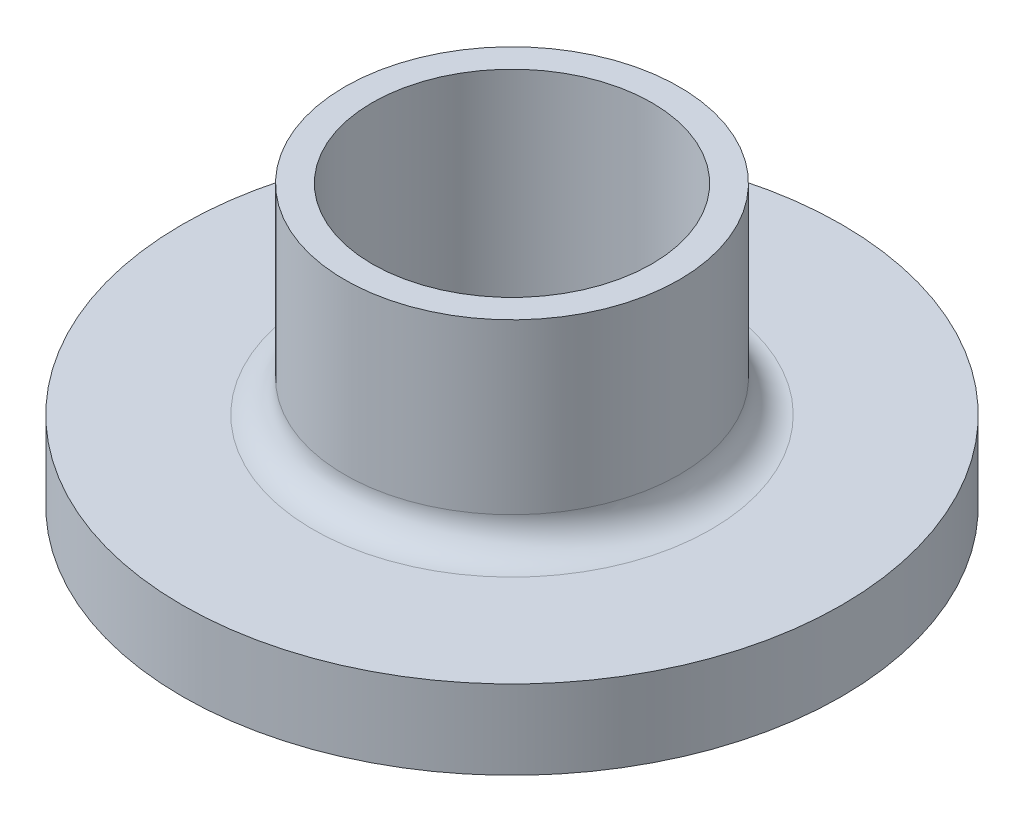
ISO-10303-21;
HEADER;
FILE_DESCRIPTION(('STEP AP214'),'2;1');
FILE_NAME('part.step','',(''),(''),'','','');
FILE_SCHEMA(('AUTOMOTIVE_DESIGN { 1 0 10303 214 1 1 1 1 }'));
ENDSEC;
DATA;
#1=APPLICATION_CONTEXT('core data for automotive mechanical design processes');
#2=APPLICATION_PROTOCOL_DEFINITION('international standard','automotive_design',2000,#1);
#3=PRODUCT_CONTEXT('',#1,'mechanical');
#4=PRODUCT('Part','Part','',(#3));
#5=PRODUCT_RELATED_PRODUCT_CATEGORY('part','',(#4));
#6=PRODUCT_DEFINITION_FORMATION('','',#4);
#7=PRODUCT_DEFINITION_CONTEXT('part definition',#1,'design');
#8=PRODUCT_DEFINITION('design','',#6,#7);
#9=PRODUCT_DEFINITION_SHAPE('','',#8);
#10=(LENGTH_UNIT() NAMED_UNIT(*) SI_UNIT(.MILLI.,.METRE.));
#11=(NAMED_UNIT(*) PLANE_ANGLE_UNIT() SI_UNIT($,.RADIAN.));
#12=(NAMED_UNIT(*) SI_UNIT($,.STERADIAN.) SOLID_ANGLE_UNIT());
#13=UNCERTAINTY_MEASURE_WITH_UNIT(LENGTH_MEASURE(1.E-05),#10,'distance_accuracy_value','');
#14=(GEOMETRIC_REPRESENTATION_CONTEXT(3) GLOBAL_UNCERTAINTY_ASSIGNED_CONTEXT((#13)) GLOBAL_UNIT_ASSIGNED_CONTEXT((#10,
#11,#12)) REPRESENTATION_CONTEXT('',''));
#15=CARTESIAN_POINT('',(0.,0.,0.));
#16=DIRECTION('',(0.,0.,1.));
#17=DIRECTION('',(1.,0.,0.));
#18=AXIS2_PLACEMENT_3D('',#15,#16,#17);
#19=CARTESIAN_POINT('',(7.9375,1.905,0.));
#20=DIRECTION('',(0.,-1.,0.));
#21=DIRECTION('',(1.,0.,0.));
#22=AXIS2_PLACEMENT_3D('',#19,#20,#21);
#23=PLANE('',#22);
#24=CARTESIAN_POINT('',(0.,1.905,0.));
#25=DIRECTION('',(0.,-1.,0.));
#26=DIRECTION('',(1.,0.,0.));
#27=AXIS2_PLACEMENT_3D('',#24,#25,#26);
#28=CIRCLE('',#27,4.7879);
#29=CARTESIAN_POINT('',(4.7879,1.905,0.));
#30=VERTEX_POINT('',#29);
#31=EDGE_CURVE('E10',#30,#30,#28,.T.);
#32=ORIENTED_EDGE('',*,*,#31,.T.);
#33=EDGE_LOOP('',(#32));
#34=FACE_BOUND('',#33,.T.);
#35=CARTESIAN_POINT('',(0.,1.905,0.));
#36=DIRECTION('',(0.,1.,0.));
#37=DIRECTION('',(-1.,0.,0.));
#38=AXIS2_PLACEMENT_3D('',#35,#36,#37);
#39=CIRCLE('',#38,7.9375);
#40=CARTESIAN_POINT('',(-7.9375,1.905,0.));
#41=VERTEX_POINT('',#40);
#42=EDGE_CURVE('E46',#41,#41,#39,.T.);
#43=ORIENTED_EDGE('',*,*,#42,.T.);
#44=EDGE_LOOP('',(#43));
#45=FACE_BOUND('',#44,.T.);
#46=ADVANCED_FACE('F35',(#34,#45),#23,.F.);
#47=CARTESIAN_POINT('',(0.,17.130002104646,0.));
#48=DIRECTION('',(0.,1.,0.));
#49=DIRECTION('',(-1.,0.,0.));
#50=AXIS2_PLACEMENT_3D('',#47,#48,#49);
#51=CYLINDRICAL_SURFACE('',#50,7.9375);
#52=ORIENTED_EDGE('',*,*,#42,.F.);
#53=EDGE_LOOP('',(#52));
#54=FACE_BOUND('',#53,.T.);
#55=CARTESIAN_POINT('',(0.,0.,0.));
#56=DIRECTION('',(0.,1.,0.));
#57=DIRECTION('',(-1.,0.,0.));
#58=AXIS2_PLACEMENT_3D('',#55,#56,#57);
#59=CIRCLE('',#58,7.9375);
#60=CARTESIAN_POINT('',(-7.9375,0.,0.));
#61=VERTEX_POINT('',#60);
#62=EDGE_CURVE('E50',#61,#61,#59,.T.);
#63=ORIENTED_EDGE('',*,*,#62,.T.);
#64=EDGE_LOOP('',(#63));
#65=FACE_BOUND('',#64,.T.);
#66=ADVANCED_FACE('F79',(#54,#65),#51,.T.);
#67=CARTESIAN_POINT('',(3.3655,0.,0.));
#68=DIRECTION('',(0.,1.,0.));
#69=DIRECTION('',(-1.,0.,0.));
#70=AXIS2_PLACEMENT_3D('',#67,#68,#69);
#71=PLANE('',#70);
#72=ORIENTED_EDGE('',*,*,#62,.F.);
#73=EDGE_LOOP('',(#72));
#74=FACE_BOUND('',#73,.T.);
#75=CARTESIAN_POINT('',(0.,0.,0.));
#76=DIRECTION('',(0.,1.,0.));
#77=DIRECTION('',(-1.,0.,0.));
#78=AXIS2_PLACEMENT_3D('',#75,#76,#77);
#79=CIRCLE('',#78,3.3655);
#80=CARTESIAN_POINT('',(-3.3655,0.,0.));
#81=VERTEX_POINT('',#80);
#82=EDGE_CURVE('E55',#81,#81,#79,.T.);
#83=ORIENTED_EDGE('',*,*,#82,.T.);
#84=EDGE_LOOP('',(#83));
#85=FACE_BOUND('',#84,.T.);
#86=ADVANCED_FACE('F83',(#74,#85),#71,.F.);
#87=CARTESIAN_POINT('',(0.,17.130002104646,0.));
#88=DIRECTION('',(0.,1.,0.));
#89=DIRECTION('',(-1.,0.,0.));
#90=AXIS2_PLACEMENT_3D('',#87,#88,#89);
#91=CYLINDRICAL_SURFACE('',#90,3.3655);
#92=ORIENTED_EDGE('',*,*,#82,.F.);
#93=EDGE_LOOP('',(#92));
#94=FACE_BOUND('',#93,.T.);
#95=CARTESIAN_POINT('',(0.,6.731,0.));
#96=DIRECTION('',(0.,1.,0.));
#97=DIRECTION('',(-1.,0.,0.));
#98=AXIS2_PLACEMENT_3D('',#95,#96,#97);
#99=CIRCLE('',#98,3.3655);
#100=CARTESIAN_POINT('',(-3.3655,6.731,0.));
#101=VERTEX_POINT('',#100);
#102=EDGE_CURVE('E58',#101,#101,#99,.T.);
#103=ORIENTED_EDGE('',*,*,#102,.T.);
#104=EDGE_LOOP('',(#103));
#105=FACE_BOUND('',#104,.T.);
#106=ADVANCED_FACE('F76',(#94,#105),#91,.F.);
#107=CARTESIAN_POINT('',(4.0259,6.731,0.));
#108=DIRECTION('',(0.,-1.,0.));
#109=DIRECTION('',(1.,0.,0.));
#110=AXIS2_PLACEMENT_3D('',#107,#108,#109);
#111=PLANE('',#110);
#112=ORIENTED_EDGE('',*,*,#102,.F.);
#113=EDGE_LOOP('',(#112));
#114=FACE_BOUND('',#113,.T.);
#115=CARTESIAN_POINT('',(0.,6.731,0.));
#116=DIRECTION('',(0.,1.,0.));
#117=DIRECTION('',(-1.,0.,0.));
#118=AXIS2_PLACEMENT_3D('',#115,#116,#117);
#119=CIRCLE('',#118,4.0259);
#120=CARTESIAN_POINT('',(-4.0259,6.731,0.));
#121=VERTEX_POINT('',#120);
#122=EDGE_CURVE('E61',#121,#121,#119,.T.);
#123=ORIENTED_EDGE('',*,*,#122,.T.);
#124=EDGE_LOOP('',(#123));
#125=FACE_BOUND('',#124,.T.);
#126=ADVANCED_FACE('F65',(#114,#125),#111,.F.);
#127=CARTESIAN_POINT('',(0.,17.130002104646,0.));
#128=DIRECTION('',(0.,1.,0.));
#129=DIRECTION('',(-1.,0.,0.));
#130=AXIS2_PLACEMENT_3D('',#127,#128,#129);
#131=CYLINDRICAL_SURFACE('',#130,4.0259);
#132=CARTESIAN_POINT('',(0.,2.667,0.));
#133=DIRECTION('',(0.,-1.,0.));
#134=DIRECTION('',(1.,0.,0.));
#135=AXIS2_PLACEMENT_3D('',#132,#133,#134);
#136=CIRCLE('',#135,4.0259);
#137=CARTESIAN_POINT('',(4.0259,2.667,0.));
#138=VERTEX_POINT('',#137);
#139=EDGE_CURVE('E42',#138,#138,#136,.F.);
#140=ORIENTED_EDGE('',*,*,#139,.T.);
#141=EDGE_LOOP('',(#140));
#142=FACE_BOUND('',#141,.T.);
#143=ORIENTED_EDGE('',*,*,#122,.F.);
#144=EDGE_LOOP('',(#143));
#145=FACE_BOUND('',#144,.T.);
#146=ADVANCED_FACE('F67',(#142,#145),#131,.T.);
#147=CARTESIAN_POINT('',(0.,2.667,0.));
#148=DIRECTION('',(0.,-1.,0.));
#149=DIRECTION('',(1.,0.,0.));
#150=AXIS2_PLACEMENT_3D('',#147,#148,#149);
#151=TOROIDAL_SURFACE('',#150,4.7879,0.762);
#152=ORIENTED_EDGE('',*,*,#31,.F.);
#153=EDGE_LOOP('',(#152));
#154=FACE_BOUND('',#153,.T.);
#155=ORIENTED_EDGE('',*,*,#139,.F.);
#156=EDGE_LOOP('',(#155));
#157=FACE_BOUND('',#156,.T.);
#158=ADVANCED_FACE('F37',(#154,#157),#151,.F.);
#159=CLOSED_SHELL('',(#46,#66,#86,#106,#126,#146,#158));
#160=MANIFOLD_SOLID_BREP('B2',#159);
#161=ADVANCED_BREP_SHAPE_REPRESENTATION('',(#18,#160),#14);
#162=SHAPE_DEFINITION_REPRESENTATION(#9,#161);
ENDSEC;
END-ISO-10303-21;
